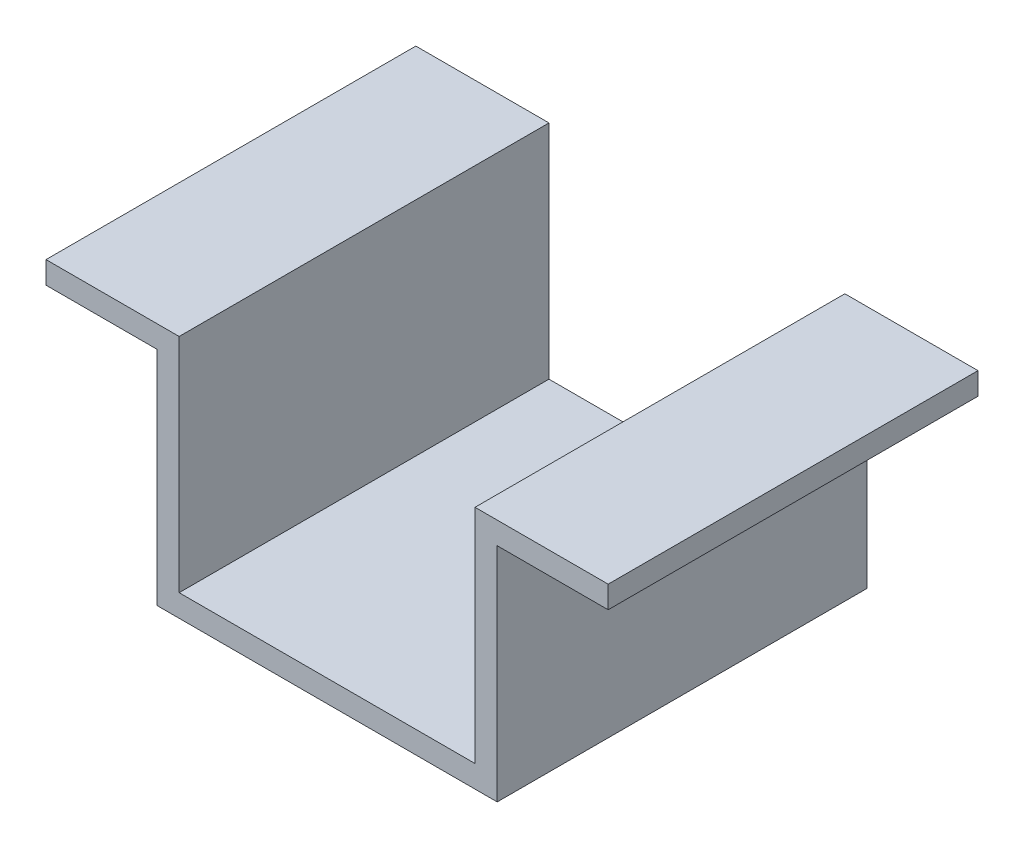
ISO-10303-21;
HEADER;
FILE_DESCRIPTION(('STEP AP214'),'2;1');
FILE_NAME('part.step','',(''),(''),'','','');
FILE_SCHEMA(('AUTOMOTIVE_DESIGN { 1 0 10303 214 1 1 1 1 }'));
ENDSEC;
DATA;
#1=APPLICATION_CONTEXT('core data for automotive mechanical design processes');
#2=APPLICATION_PROTOCOL_DEFINITION('international standard','automotive_design',2000,#1);
#3=PRODUCT_CONTEXT('',#1,'mechanical');
#4=PRODUCT('Part','Part','',(#3));
#5=PRODUCT_RELATED_PRODUCT_CATEGORY('part','',(#4));
#6=PRODUCT_DEFINITION_FORMATION('','',#4);
#7=PRODUCT_DEFINITION_CONTEXT('part definition',#1,'design');
#8=PRODUCT_DEFINITION('design','',#6,#7);
#9=PRODUCT_DEFINITION_SHAPE('','',#8);
#10=(LENGTH_UNIT() NAMED_UNIT(*) SI_UNIT(.MILLI.,.METRE.));
#11=(NAMED_UNIT(*) PLANE_ANGLE_UNIT() SI_UNIT($,.RADIAN.));
#12=(NAMED_UNIT(*) SI_UNIT($,.STERADIAN.) SOLID_ANGLE_UNIT());
#13=UNCERTAINTY_MEASURE_WITH_UNIT(LENGTH_MEASURE(1.E-05),#10,'distance_accuracy_value','');
#14=(GEOMETRIC_REPRESENTATION_CONTEXT(3) GLOBAL_UNCERTAINTY_ASSIGNED_CONTEXT((#13)) GLOBAL_UNIT_ASSIGNED_CONTEXT((#10,
#11,#12)) REPRESENTATION_CONTEXT('',''));
#15=CARTESIAN_POINT('',(0.,0.,0.));
#16=DIRECTION('',(0.,0.,1.));
#17=DIRECTION('',(1.,0.,0.));
#18=AXIS2_PLACEMENT_3D('',#15,#16,#17);
#19=CARTESIAN_POINT('',(10.,39.5911756362888,25.));
#20=DIRECTION('',(1.,0.,0.));
#21=DIRECTION('',(0.,1.,0.));
#22=AXIS2_PLACEMENT_3D('',#19,#20,#21);
#23=PLANE('',#22);
#24=DIRECTION('',(0.,-1.,0.));
#25=VECTOR('',#24,1.);
#26=CARTESIAN_POINT('',(10.,39.5911756362888,0.));
#27=LINE('',#26,#25);
#28=CARTESIAN_POINT('',(10.,39.5911756362888,0.));
#29=VERTEX_POINT('',#28);
#30=CARTESIAN_POINT('',(10.,24.5911756362888,0.));
#31=VERTEX_POINT('',#30);
#32=EDGE_CURVE('E157',#29,#31,#27,.T.);
#33=ORIENTED_EDGE('',*,*,#32,.T.);
#34=DIRECTION('',(0.,0.,-1.));
#35=VECTOR('',#34,1.);
#36=CARTESIAN_POINT('',(10.,24.5911756362888,25.));
#37=LINE('',#36,#35);
#38=CARTESIAN_POINT('',(10.,24.5911756362888,25.));
#39=VERTEX_POINT('',#38);
#40=EDGE_CURVE('E11',#39,#31,#37,.T.);
#41=ORIENTED_EDGE('',*,*,#40,.F.);
#42=DIRECTION('',(0.,-1.,0.));
#43=VECTOR('',#42,1.);
#44=CARTESIAN_POINT('',(10.,39.5911756362888,25.));
#45=LINE('',#44,#43);
#46=CARTESIAN_POINT('',(10.,39.5911756362888,25.));
#47=VERTEX_POINT('',#46);
#48=EDGE_CURVE('E179',#47,#39,#45,.T.);
#49=ORIENTED_EDGE('',*,*,#48,.F.);
#50=DIRECTION('',(0.,0.,-1.));
#51=VECTOR('',#50,1.);
#52=CARTESIAN_POINT('',(10.,39.5911756362888,25.));
#53=LINE('',#52,#51);
#54=EDGE_CURVE('E153',#47,#29,#53,.T.);
#55=ORIENTED_EDGE('',*,*,#54,.T.);
#56=EDGE_LOOP('',(#33,#41,#49,#55));
#57=FACE_BOUND('',#56,.T.);
#58=ADVANCED_FACE('F37',(#57),#23,.F.);
#59=CARTESIAN_POINT('',(-10.,24.5911756362888,25.));
#60=DIRECTION('',(0.,-1.,0.));
#61=DIRECTION('',(0.,0.,-1.));
#62=AXIS2_PLACEMENT_3D('',#59,#60,#61);
#63=PLANE('',#62);
#64=DIRECTION('',(-1.,0.,0.));
#65=VECTOR('',#64,1.);
#66=CARTESIAN_POINT('',(-10.,24.5911756362888,0.));
#67=LINE('',#66,#65);
#68=CARTESIAN_POINT('',(-10.,24.5911756362888,0.));
#69=VERTEX_POINT('',#68);
#70=EDGE_CURVE('E160',#31,#69,#67,.T.);
#71=ORIENTED_EDGE('',*,*,#70,.T.);
#72=DIRECTION('',(0.,0.,-1.));
#73=VECTOR('',#72,1.);
#74=CARTESIAN_POINT('',(-10.,24.5911756362888,25.));
#75=LINE('',#74,#73);
#76=CARTESIAN_POINT('',(-10.,24.5911756362888,25.));
#77=VERTEX_POINT('',#76);
#78=EDGE_CURVE('E45',#77,#69,#75,.T.);
#79=ORIENTED_EDGE('',*,*,#78,.F.);
#80=DIRECTION('',(-1.,0.,0.));
#81=VECTOR('',#80,1.);
#82=CARTESIAN_POINT('',(-10.,24.5911756362888,25.));
#83=LINE('',#82,#81);
#84=EDGE_CURVE('E108',#39,#77,#83,.T.);
#85=ORIENTED_EDGE('',*,*,#84,.F.);
#86=ORIENTED_EDGE('',*,*,#40,.T.);
#87=EDGE_LOOP('',(#71,#79,#85,#86));
#88=FACE_BOUND('',#87,.T.);
#89=ADVANCED_FACE('F257',(#88),#63,.F.);
#90=CARTESIAN_POINT('',(-10.,39.5911756362888,25.));
#91=DIRECTION('',(-1.,0.,0.));
#92=DIRECTION('',(0.,-1.,0.));
#93=AXIS2_PLACEMENT_3D('',#90,#91,#92);
#94=PLANE('',#93);
#95=DIRECTION('',(0.,1.,0.));
#96=VECTOR('',#95,1.);
#97=CARTESIAN_POINT('',(-10.,39.5911756362888,0.));
#98=LINE('',#97,#96);
#99=CARTESIAN_POINT('',(-10.,39.5911756362888,0.));
#100=VERTEX_POINT('',#99);
#101=EDGE_CURVE('E162',#69,#100,#98,.T.);
#102=ORIENTED_EDGE('',*,*,#101,.T.);
#103=DIRECTION('',(0.,0.,-1.));
#104=VECTOR('',#103,1.);
#105=CARTESIAN_POINT('',(-10.,39.5911756362888,25.));
#106=LINE('',#105,#104);
#107=CARTESIAN_POINT('',(-10.,39.5911756362888,25.));
#108=VERTEX_POINT('',#107);
#109=EDGE_CURVE('E198',#108,#100,#106,.T.);
#110=ORIENTED_EDGE('',*,*,#109,.F.);
#111=DIRECTION('',(0.,1.,0.));
#112=VECTOR('',#111,1.);
#113=CARTESIAN_POINT('',(-10.,39.5911756362888,25.));
#114=LINE('',#113,#112);
#115=EDGE_CURVE('E206',#77,#108,#114,.T.);
#116=ORIENTED_EDGE('',*,*,#115,.F.);
#117=ORIENTED_EDGE('',*,*,#78,.T.);
#118=EDGE_LOOP('',(#102,#110,#116,#117));
#119=FACE_BOUND('',#118,.T.);
#120=ADVANCED_FACE('F204',(#119),#94,.F.);
#121=CARTESIAN_POINT('',(-10.,39.5911756362888,25.));
#122=DIRECTION('',(0.,-1.,0.));
#123=DIRECTION('',(0.,0.,-1.));
#124=AXIS2_PLACEMENT_3D('',#121,#122,#123);
#125=PLANE('',#124);
#126=DIRECTION('',(-1.,0.,0.));
#127=VECTOR('',#126,1.);
#128=CARTESIAN_POINT('',(-10.,39.5911756362888,0.));
#129=LINE('',#128,#127);
#130=CARTESIAN_POINT('',(-19.,39.5911756362888,0.));
#131=VERTEX_POINT('',#130);
#132=EDGE_CURVE('E164',#100,#131,#129,.T.);
#133=ORIENTED_EDGE('',*,*,#132,.T.);
#134=DIRECTION('',(0.,0.,-1.));
#135=VECTOR('',#134,1.);
#136=CARTESIAN_POINT('',(-19.,39.5911756362888,25.));
#137=LINE('',#136,#135);
#138=CARTESIAN_POINT('',(-19.,39.5911756362888,25.));
#139=VERTEX_POINT('',#138);
#140=EDGE_CURVE('E195',#139,#131,#137,.T.);
#141=ORIENTED_EDGE('',*,*,#140,.F.);
#142=DIRECTION('',(-1.,0.,0.));
#143=VECTOR('',#142,1.);
#144=CARTESIAN_POINT('',(-10.,39.5911756362888,25.));
#145=LINE('',#144,#143);
#146=EDGE_CURVE('E224',#108,#139,#145,.T.);
#147=ORIENTED_EDGE('',*,*,#146,.F.);
#148=ORIENTED_EDGE('',*,*,#109,.T.);
#149=EDGE_LOOP('',(#133,#141,#147,#148));
#150=FACE_BOUND('',#149,.T.);
#151=ADVANCED_FACE('F215',(#150),#125,.F.);
#152=CARTESIAN_POINT('',(-19.,39.5911756362888,25.));
#153=DIRECTION('',(1.,0.,0.));
#154=DIRECTION('',(0.,0.,-1.));
#155=AXIS2_PLACEMENT_3D('',#152,#153,#154);
#156=PLANE('',#155);
#157=DIRECTION('',(0.,-1.,0.));
#158=VECTOR('',#157,1.);
#159=CARTESIAN_POINT('',(-19.,39.5911756362888,0.));
#160=LINE('',#159,#158);
#161=CARTESIAN_POINT('',(-19.,38.0911756362888,0.));
#162=VERTEX_POINT('',#161);
#163=EDGE_CURVE('E166',#131,#162,#160,.T.);
#164=ORIENTED_EDGE('',*,*,#163,.T.);
#165=DIRECTION('',(0.,0.,-1.));
#166=VECTOR('',#165,1.);
#167=CARTESIAN_POINT('',(-19.,38.0911756362888,25.));
#168=LINE('',#167,#166);
#169=CARTESIAN_POINT('',(-19.,38.0911756362888,25.));
#170=VERTEX_POINT('',#169);
#171=EDGE_CURVE('E192',#170,#162,#168,.T.);
#172=ORIENTED_EDGE('',*,*,#171,.F.);
#173=DIRECTION('',(0.,-1.,0.));
#174=VECTOR('',#173,1.);
#175=CARTESIAN_POINT('',(-19.,39.5911756362888,25.));
#176=LINE('',#175,#174);
#177=EDGE_CURVE('E221',#139,#170,#176,.T.);
#178=ORIENTED_EDGE('',*,*,#177,.F.);
#179=ORIENTED_EDGE('',*,*,#140,.T.);
#180=EDGE_LOOP('',(#164,#172,#178,#179));
#181=FACE_BOUND('',#180,.T.);
#182=ADVANCED_FACE('F219',(#181),#156,.F.);
#183=CARTESIAN_POINT('',(-19.,38.0911756362888,25.));
#184=DIRECTION('',(0.,1.,0.));
#185=DIRECTION('',(0.,0.,1.));
#186=AXIS2_PLACEMENT_3D('',#183,#184,#185);
#187=PLANE('',#186);
#188=DIRECTION('',(1.,0.,0.));
#189=VECTOR('',#188,1.);
#190=CARTESIAN_POINT('',(-19.,38.0911756362888,0.));
#191=LINE('',#190,#189);
#192=CARTESIAN_POINT('',(-11.5,38.0911756362888,0.));
#193=VERTEX_POINT('',#192);
#194=EDGE_CURVE('E168',#162,#193,#191,.T.);
#195=ORIENTED_EDGE('',*,*,#194,.T.);
#196=DIRECTION('',(0.,0.,-1.));
#197=VECTOR('',#196,1.);
#198=CARTESIAN_POINT('',(-11.5,38.0911756362888,25.));
#199=LINE('',#198,#197);
#200=CARTESIAN_POINT('',(-11.5,38.0911756362888,25.));
#201=VERTEX_POINT('',#200);
#202=EDGE_CURVE('E189',#201,#193,#199,.T.);
#203=ORIENTED_EDGE('',*,*,#202,.F.);
#204=DIRECTION('',(1.,0.,0.));
#205=VECTOR('',#204,1.);
#206=CARTESIAN_POINT('',(-19.,38.0911756362888,25.));
#207=LINE('',#206,#205);
#208=EDGE_CURVE('E223',#170,#201,#207,.T.);
#209=ORIENTED_EDGE('',*,*,#208,.F.);
#210=ORIENTED_EDGE('',*,*,#171,.T.);
#211=EDGE_LOOP('',(#195,#203,#209,#210));
#212=FACE_BOUND('',#211,.T.);
#213=ADVANCED_FACE('F270',(#212),#187,.F.);
#214=CARTESIAN_POINT('',(-11.5,38.0911756362888,25.));
#215=DIRECTION('',(1.,0.,0.));
#216=DIRECTION('',(0.,1.,0.));
#217=AXIS2_PLACEMENT_3D('',#214,#215,#216);
#218=PLANE('',#217);
#219=DIRECTION('',(0.,-1.,0.));
#220=VECTOR('',#219,1.);
#221=CARTESIAN_POINT('',(-11.5,38.0911756362888,0.));
#222=LINE('',#221,#220);
#223=CARTESIAN_POINT('',(-11.5,23.0911756362888,0.));
#224=VERTEX_POINT('',#223);
#225=EDGE_CURVE('E170',#193,#224,#222,.T.);
#226=ORIENTED_EDGE('',*,*,#225,.T.);
#227=DIRECTION('',(0.,0.,-1.));
#228=VECTOR('',#227,1.);
#229=CARTESIAN_POINT('',(-11.5,23.0911756362888,25.));
#230=LINE('',#229,#228);
#231=CARTESIAN_POINT('',(-11.5,23.0911756362888,25.));
#232=VERTEX_POINT('',#231);
#233=EDGE_CURVE('E186',#232,#224,#230,.T.);
#234=ORIENTED_EDGE('',*,*,#233,.F.);
#235=DIRECTION('',(0.,-1.,0.));
#236=VECTOR('',#235,1.);
#237=CARTESIAN_POINT('',(-11.5,38.0911756362888,25.));
#238=LINE('',#237,#236);
#239=EDGE_CURVE('E226',#201,#232,#238,.T.);
#240=ORIENTED_EDGE('',*,*,#239,.F.);
#241=ORIENTED_EDGE('',*,*,#202,.T.);
#242=EDGE_LOOP('',(#226,#234,#240,#241));
#243=FACE_BOUND('',#242,.T.);
#244=ADVANCED_FACE('F273',(#243),#218,.F.);
#245=CARTESIAN_POINT('',(-11.5,23.0911756362888,25.));
#246=DIRECTION('',(0.,1.,0.));
#247=DIRECTION('',(0.,0.,1.));
#248=AXIS2_PLACEMENT_3D('',#245,#246,#247);
#249=PLANE('',#248);
#250=DIRECTION('',(1.,0.,0.));
#251=VECTOR('',#250,1.);
#252=CARTESIAN_POINT('',(-11.5,23.0911756362888,0.));
#253=LINE('',#252,#251);
#254=CARTESIAN_POINT('',(11.5,23.0911756362888,0.));
#255=VERTEX_POINT('',#254);
#256=EDGE_CURVE('E172',#224,#255,#253,.T.);
#257=ORIENTED_EDGE('',*,*,#256,.T.);
#258=DIRECTION('',(0.,0.,-1.));
#259=VECTOR('',#258,1.);
#260=CARTESIAN_POINT('',(11.5,23.0911756362888,25.));
#261=LINE('',#260,#259);
#262=CARTESIAN_POINT('',(11.5,23.0911756362888,25.));
#263=VERTEX_POINT('',#262);
#264=EDGE_CURVE('E183',#263,#255,#261,.T.);
#265=ORIENTED_EDGE('',*,*,#264,.F.);
#266=DIRECTION('',(1.,0.,0.));
#267=VECTOR('',#266,1.);
#268=CARTESIAN_POINT('',(-11.5,23.0911756362888,25.));
#269=LINE('',#268,#267);
#270=EDGE_CURVE('E232',#232,#263,#269,.T.);
#271=ORIENTED_EDGE('',*,*,#270,.F.);
#272=ORIENTED_EDGE('',*,*,#233,.T.);
#273=EDGE_LOOP('',(#257,#265,#271,#272));
#274=FACE_BOUND('',#273,.T.);
#275=ADVANCED_FACE('F238',(#274),#249,.F.);
#276=CARTESIAN_POINT('',(11.5,38.0911756362888,25.));
#277=DIRECTION('',(-1.,0.,0.));
#278=DIRECTION('',(0.,-1.,0.));
#279=AXIS2_PLACEMENT_3D('',#276,#277,#278);
#280=PLANE('',#279);
#281=DIRECTION('',(0.,1.,0.));
#282=VECTOR('',#281,1.);
#283=CARTESIAN_POINT('',(11.5,38.0911756362888,0.));
#284=LINE('',#283,#282);
#285=CARTESIAN_POINT('',(11.5,38.0911756362888,0.));
#286=VERTEX_POINT('',#285);
#287=EDGE_CURVE('E174',#255,#286,#284,.T.);
#288=ORIENTED_EDGE('',*,*,#287,.T.);
#289=DIRECTION('',(0.,0.,-1.));
#290=VECTOR('',#289,1.);
#291=CARTESIAN_POINT('',(11.5,38.0911756362888,25.));
#292=LINE('',#291,#290);
#293=CARTESIAN_POINT('',(11.5,38.0911756362888,25.));
#294=VERTEX_POINT('',#293);
#295=EDGE_CURVE('E148',#294,#286,#292,.T.);
#296=ORIENTED_EDGE('',*,*,#295,.F.);
#297=DIRECTION('',(0.,1.,0.));
#298=VECTOR('',#297,1.);
#299=CARTESIAN_POINT('',(11.5,38.0911756362888,25.));
#300=LINE('',#299,#298);
#301=EDGE_CURVE('E139',#263,#294,#300,.T.);
#302=ORIENTED_EDGE('',*,*,#301,.F.);
#303=ORIENTED_EDGE('',*,*,#264,.T.);
#304=EDGE_LOOP('',(#288,#296,#302,#303));
#305=FACE_BOUND('',#304,.T.);
#306=ADVANCED_FACE('F242',(#305),#280,.F.);
#307=CARTESIAN_POINT('',(19.,38.0911756362888,25.));
#308=DIRECTION('',(0.,1.,0.));
#309=DIRECTION('',(0.,0.,1.));
#310=AXIS2_PLACEMENT_3D('',#307,#308,#309);
#311=PLANE('',#310);
#312=DIRECTION('',(1.,0.,0.));
#313=VECTOR('',#312,1.);
#314=CARTESIAN_POINT('',(19.,38.0911756362888,0.));
#315=LINE('',#314,#313);
#316=CARTESIAN_POINT('',(19.,38.0911756362888,0.));
#317=VERTEX_POINT('',#316);
#318=EDGE_CURVE('E147',#286,#317,#315,.T.);
#319=ORIENTED_EDGE('',*,*,#318,.T.);
#320=DIRECTION('',(0.,0.,-1.));
#321=VECTOR('',#320,1.);
#322=CARTESIAN_POINT('',(19.,38.0911756362888,25.));
#323=LINE('',#322,#321);
#324=CARTESIAN_POINT('',(19.,38.0911756362888,25.));
#325=VERTEX_POINT('',#324);
#326=EDGE_CURVE('E144',#325,#317,#323,.T.);
#327=ORIENTED_EDGE('',*,*,#326,.F.);
#328=DIRECTION('',(1.,0.,0.));
#329=VECTOR('',#328,1.);
#330=CARTESIAN_POINT('',(19.,38.0911756362888,25.));
#331=LINE('',#330,#329);
#332=EDGE_CURVE('E133',#294,#325,#331,.T.);
#333=ORIENTED_EDGE('',*,*,#332,.F.);
#334=ORIENTED_EDGE('',*,*,#295,.T.);
#335=EDGE_LOOP('',(#319,#327,#333,#334));
#336=FACE_BOUND('',#335,.T.);
#337=ADVANCED_FACE('F145',(#336),#311,.F.);
#338=CARTESIAN_POINT('',(19.,39.5911756362888,25.));
#339=DIRECTION('',(-1.,0.,0.));
#340=DIRECTION('',(0.,0.,1.));
#341=AXIS2_PLACEMENT_3D('',#338,#339,#340);
#342=PLANE('',#341);
#343=DIRECTION('',(0.,1.,0.));
#344=VECTOR('',#343,1.);
#345=CARTESIAN_POINT('',(19.,39.5911756362888,0.));
#346=LINE('',#345,#344);
#347=CARTESIAN_POINT('',(19.,39.5911756362888,0.));
#348=VERTEX_POINT('',#347);
#349=EDGE_CURVE('E94',#317,#348,#346,.T.);
#350=ORIENTED_EDGE('',*,*,#349,.T.);
#351=DIRECTION('',(0.,0.,-1.));
#352=VECTOR('',#351,1.);
#353=CARTESIAN_POINT('',(19.,39.5911756362888,25.));
#354=LINE('',#353,#352);
#355=CARTESIAN_POINT('',(19.,39.5911756362888,25.));
#356=VERTEX_POINT('',#355);
#357=EDGE_CURVE('E149',#356,#348,#354,.T.);
#358=ORIENTED_EDGE('',*,*,#357,.F.);
#359=DIRECTION('',(0.,1.,0.));
#360=VECTOR('',#359,1.);
#361=CARTESIAN_POINT('',(19.,39.5911756362888,25.));
#362=LINE('',#361,#360);
#363=EDGE_CURVE('E137',#325,#356,#362,.T.);
#364=ORIENTED_EDGE('',*,*,#363,.F.);
#365=ORIENTED_EDGE('',*,*,#326,.T.);
#366=EDGE_LOOP('',(#350,#358,#364,#365));
#367=FACE_BOUND('',#366,.T.);
#368=ADVANCED_FACE('F151',(#367),#342,.F.);
#369=CARTESIAN_POINT('',(10.,39.5911756362888,25.));
#370=DIRECTION('',(0.,-1.,0.));
#371=DIRECTION('',(0.,0.,-1.));
#372=AXIS2_PLACEMENT_3D('',#369,#370,#371);
#373=PLANE('',#372);
#374=DIRECTION('',(-1.,0.,0.));
#375=VECTOR('',#374,1.);
#376=CARTESIAN_POINT('',(10.,39.5911756362888,0.));
#377=LINE('',#376,#375);
#378=EDGE_CURVE('E100',#348,#29,#377,.T.);
#379=ORIENTED_EDGE('',*,*,#378,.T.);
#380=ORIENTED_EDGE('',*,*,#54,.F.);
#381=DIRECTION('',(-1.,0.,0.));
#382=VECTOR('',#381,1.);
#383=CARTESIAN_POINT('',(10.,39.5911756362888,25.));
#384=LINE('',#383,#382);
#385=EDGE_CURVE('E53',#356,#47,#384,.T.);
#386=ORIENTED_EDGE('',*,*,#385,.F.);
#387=ORIENTED_EDGE('',*,*,#357,.T.);
#388=EDGE_LOOP('',(#379,#380,#386,#387));
#389=FACE_BOUND('',#388,.T.);
#390=ADVANCED_FACE('F246',(#389),#373,.F.);
#391=CARTESIAN_POINT('',(0.,0.,25.));
#392=DIRECTION('',(0.,0.,1.));
#393=DIRECTION('',(1.,0.,0.));
#394=AXIS2_PLACEMENT_3D('',#391,#392,#393);
#395=PLANE('',#394);
#396=ORIENTED_EDGE('',*,*,#48,.T.);
#397=ORIENTED_EDGE('',*,*,#84,.T.);
#398=ORIENTED_EDGE('',*,*,#115,.T.);
#399=ORIENTED_EDGE('',*,*,#146,.T.);
#400=ORIENTED_EDGE('',*,*,#177,.T.);
#401=ORIENTED_EDGE('',*,*,#208,.T.);
#402=ORIENTED_EDGE('',*,*,#239,.T.);
#403=ORIENTED_EDGE('',*,*,#270,.T.);
#404=ORIENTED_EDGE('',*,*,#301,.T.);
#405=ORIENTED_EDGE('',*,*,#332,.T.);
#406=ORIENTED_EDGE('',*,*,#363,.T.);
#407=ORIENTED_EDGE('',*,*,#385,.T.);
#408=EDGE_LOOP('',(#396,#397,#398,#399,#400,#401,#402,#403,#404,#405,#406,#407));
#409=FACE_BOUND('',#408,.T.);
#410=ADVANCED_FACE('F135',(#409),#395,.T.);
#411=CARTESIAN_POINT('',(0.,0.,0.));
#412=DIRECTION('',(0.,0.,1.));
#413=DIRECTION('',(1.,0.,0.));
#414=AXIS2_PLACEMENT_3D('',#411,#412,#413);
#415=PLANE('',#414);
#416=ORIENTED_EDGE('',*,*,#32,.F.);
#417=ORIENTED_EDGE('',*,*,#378,.F.);
#418=ORIENTED_EDGE('',*,*,#349,.F.);
#419=ORIENTED_EDGE('',*,*,#318,.F.);
#420=ORIENTED_EDGE('',*,*,#287,.F.);
#421=ORIENTED_EDGE('',*,*,#256,.F.);
#422=ORIENTED_EDGE('',*,*,#225,.F.);
#423=ORIENTED_EDGE('',*,*,#194,.F.);
#424=ORIENTED_EDGE('',*,*,#163,.F.);
#425=ORIENTED_EDGE('',*,*,#132,.F.);
#426=ORIENTED_EDGE('',*,*,#101,.F.);
#427=ORIENTED_EDGE('',*,*,#70,.F.);
#428=EDGE_LOOP('',(#416,#417,#418,#419,#420,#421,#422,#423,#424,#425,#426,#427));
#429=FACE_BOUND('',#428,.T.);
#430=ADVANCED_FACE('F210',(#429),#415,.F.);
#431=CLOSED_SHELL('',(#58,#89,#120,#151,#182,#213,#244,#275,#306,#337,#368,#390,#410,#430));
#432=MANIFOLD_SOLID_BREP('B2',#431);
#433=ADVANCED_BREP_SHAPE_REPRESENTATION('',(#18,#432),#14);
#434=SHAPE_DEFINITION_REPRESENTATION(#9,#433);
ENDSEC;
END-ISO-10303-21;
